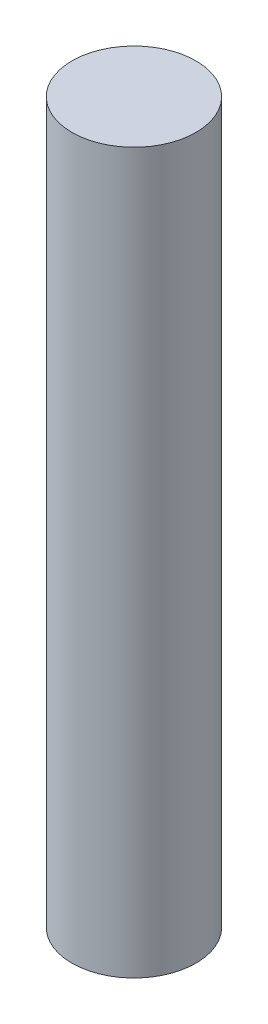
ISO-10303-21;
HEADER;
FILE_DESCRIPTION(('STEP AP214'),'2;1');
FILE_NAME('part.step','',(''),(''),'','','');
FILE_SCHEMA(('AUTOMOTIVE_DESIGN { 1 0 10303 214 1 1 1 1 }'));
ENDSEC;
DATA;
#1=APPLICATION_CONTEXT('core data for automotive mechanical design processes');
#2=APPLICATION_PROTOCOL_DEFINITION('international standard','automotive_design',2000,#1);
#3=PRODUCT_CONTEXT('',#1,'mechanical');
#4=PRODUCT('Part','Part','',(#3));
#5=PRODUCT_RELATED_PRODUCT_CATEGORY('part','',(#4));
#6=PRODUCT_DEFINITION_FORMATION('','',#4);
#7=PRODUCT_DEFINITION_CONTEXT('part definition',#1,'design');
#8=PRODUCT_DEFINITION('design','',#6,#7);
#9=PRODUCT_DEFINITION_SHAPE('','',#8);
#10=(LENGTH_UNIT() NAMED_UNIT(*) SI_UNIT(.MILLI.,.METRE.));
#11=(NAMED_UNIT(*) PLANE_ANGLE_UNIT() SI_UNIT($,.RADIAN.));
#12=(NAMED_UNIT(*) SI_UNIT($,.STERADIAN.) SOLID_ANGLE_UNIT());
#13=UNCERTAINTY_MEASURE_WITH_UNIT(LENGTH_MEASURE(1.E-05),#10,'distance_accuracy_value','');
#14=(GEOMETRIC_REPRESENTATION_CONTEXT(3) GLOBAL_UNCERTAINTY_ASSIGNED_CONTEXT((#13)) GLOBAL_UNIT_ASSIGNED_CONTEXT((#10,
#11,#12)) REPRESENTATION_CONTEXT('',''));
#15=CARTESIAN_POINT('',(0.,0.,0.));
#16=DIRECTION('',(0.,0.,1.));
#17=DIRECTION('',(1.,0.,0.));
#18=AXIS2_PLACEMENT_3D('',#15,#16,#17);
#19=CARTESIAN_POINT('',(0.,-9.525,0.));
#20=DIRECTION('',(0.,1.,0.));
#21=DIRECTION('',(0.,0.,1.));
#22=AXIS2_PLACEMENT_3D('',#19,#20,#21);
#23=CYLINDRICAL_SURFACE('',#22,4.7625);
#24=CARTESIAN_POINT('',(0.,0.,0.));
#25=DIRECTION('',(0.,1.,0.));
#26=DIRECTION('',(0.,0.,1.));
#27=AXIS2_PLACEMENT_3D('',#24,#25,#26);
#28=CIRCLE('',#27,4.7625);
#29=CARTESIAN_POINT('',(0.,0.,4.7625));
#30=VERTEX_POINT('',#29);
#31=EDGE_CURVE('E10',#30,#30,#28,.T.);
#32=CARTESIAN_POINT('',(0.,-55.245,0.));
#33=DIRECTION('',(0.,-1.,0.));
#34=DIRECTION('',(0.,0.,-1.));
#35=AXIS2_PLACEMENT_3D('',#32,#33,#34);
#36=CIRCLE('',#35,4.7625);
#37=CARTESIAN_POINT('',(0.,-55.245,4.7625));
#38=VERTEX_POINT('',#37);
#39=EDGE_CURVE('E40',#38,#38,#36,.T.);
#40=CARTESIAN_POINT('',(0.,0.,4.7625));
#41=CARTESIAN_POINT('',(0.,-0.575468749999999,4.7625));
#42=CARTESIAN_POINT('',(0.,-1.1509375,4.7625));
#43=CARTESIAN_POINT('',(0.,-2.301875,4.7625));
#44=CARTESIAN_POINT('',(0.,-2.87734375,4.7625));
#45=CARTESIAN_POINT('',(0.,-4.02828125,4.7625));
#46=CARTESIAN_POINT('',(0.,-4.60375,4.7625));
#47=CARTESIAN_POINT('',(0.,-5.7546875,4.7625));
#48=CARTESIAN_POINT('',(0.,-6.33015625,4.7625));
#49=CARTESIAN_POINT('',(0.,-7.48109375,4.7625));
#50=CARTESIAN_POINT('',(0.,-8.0565625,4.7625));
#51=CARTESIAN_POINT('',(0.,-9.2075,4.7625));
#52=CARTESIAN_POINT('',(0.,-9.78296875,4.7625));
#53=CARTESIAN_POINT('',(0.,-10.93390625,4.7625));
#54=CARTESIAN_POINT('',(0.,-11.509375,4.7625));
#55=CARTESIAN_POINT('',(0.,-12.6603125,4.7625));
#56=CARTESIAN_POINT('',(0.,-13.23578125,4.7625));
#57=CARTESIAN_POINT('',(0.,-14.38671875,4.7625));
#58=CARTESIAN_POINT('',(0.,-14.9621875,4.7625));
#59=CARTESIAN_POINT('',(0.,-16.113125,4.7625));
#60=CARTESIAN_POINT('',(0.,-16.68859375,4.7625));
#61=CARTESIAN_POINT('',(0.,-17.83953125,4.7625));
#62=CARTESIAN_POINT('',(0.,-18.415,4.7625));
#63=CARTESIAN_POINT('',(0.,-19.5659375,4.7625));
#64=CARTESIAN_POINT('',(0.,-20.14140625,4.7625));
#65=CARTESIAN_POINT('',(0.,-21.29234375,4.7625));
#66=CARTESIAN_POINT('',(0.,-21.8678125,4.7625));
#67=CARTESIAN_POINT('',(0.,-23.01875,4.7625));
#68=CARTESIAN_POINT('',(0.,-23.59421875,4.7625));
#69=CARTESIAN_POINT('',(0.,-24.74515625,4.7625));
#70=CARTESIAN_POINT('',(0.,-25.320625,4.7625));
#71=CARTESIAN_POINT('',(0.,-26.4715625,4.7625));
#72=CARTESIAN_POINT('',(0.,-27.04703125,4.7625));
#73=CARTESIAN_POINT('',(0.,-28.19796875,4.7625));
#74=CARTESIAN_POINT('',(0.,-28.7734375,4.7625));
#75=CARTESIAN_POINT('',(0.,-29.924375,4.7625));
#76=CARTESIAN_POINT('',(0.,-30.49984375,4.7625));
#77=CARTESIAN_POINT('',(0.,-31.65078125,4.7625));
#78=CARTESIAN_POINT('',(0.,-32.22625,4.7625));
#79=CARTESIAN_POINT('',(0.,-33.3771875,4.7625));
#80=CARTESIAN_POINT('',(0.,-33.95265625,4.7625));
#81=CARTESIAN_POINT('',(0.,-35.10359375,4.7625));
#82=CARTESIAN_POINT('',(0.,-35.6790625,4.7625));
#83=CARTESIAN_POINT('',(0.,-36.83,4.7625));
#84=CARTESIAN_POINT('',(0.,-37.40546875,4.7625));
#85=CARTESIAN_POINT('',(0.,-38.55640625,4.7625));
#86=CARTESIAN_POINT('',(0.,-39.131875,4.7625));
#87=CARTESIAN_POINT('',(0.,-40.2828125,4.7625));
#88=CARTESIAN_POINT('',(0.,-40.85828125,4.7625));
#89=CARTESIAN_POINT('',(0.,-42.00921875,4.7625));
#90=CARTESIAN_POINT('',(0.,-42.5846875,4.7625));
#91=CARTESIAN_POINT('',(0.,-43.735625,4.7625));
#92=CARTESIAN_POINT('',(0.,-44.31109375,4.7625));
#93=CARTESIAN_POINT('',(0.,-45.46203125,4.7625));
#94=CARTESIAN_POINT('',(0.,-46.0375,4.7625));
#95=CARTESIAN_POINT('',(0.,-47.1884375,4.7625));
#96=CARTESIAN_POINT('',(0.,-47.76390625,4.7625));
#97=CARTESIAN_POINT('',(0.,-48.91484375,4.7625));
#98=CARTESIAN_POINT('',(0.,-49.4903125,4.7625));
#99=CARTESIAN_POINT('',(0.,-50.64125,4.7625));
#100=CARTESIAN_POINT('',(0.,-51.21671875,4.7625));
#101=CARTESIAN_POINT('',(0.,-52.36765625,4.7625));
#102=CARTESIAN_POINT('',(0.,-52.943125,4.7625));
#103=CARTESIAN_POINT('',(0.,-54.0940625,4.7625));
#104=CARTESIAN_POINT('',(0.,-54.66953125,4.7625));
#105=CARTESIAN_POINT('',(0.,-55.245,4.7625));
#106=B_SPLINE_CURVE_WITH_KNOTS('',3,(#40,#41,#42,#43,#44,#45,#46,#47,#48,#49,#50,#51,#52,#53,
#54,#55,#56,#57,#58,#59,#60,#61,#62,#63,#64,#65,#66,#67,#68,#69,#70,#71,#72,#73,#74,#75,#76,#77,
#78,#79,#80,#81,#82,#83,#84,#85,#86,#87,#88,#89,#90,#91,#92,#93,#94,#95,#96,#97,#98,#99,#100,
#101,#102,#103,#104,#105),.UNSPECIFIED.,.F.,.F.,(4,2,2,2,2,2,2,2,2,2,2,2,2,2,2,2,2,2,2,2,2,2,2,
2,2,2,2,2,2,2,2,2,4),(0.,1.72640625,3.4528125,5.17921875,6.905625,8.63203125,10.3584375,
12.08484375,13.81125,15.53765625,17.2640625,18.99046875,20.716875,22.44328125,24.1696875,
25.89609375,27.6225,29.34890625,31.0753125,32.80171875,34.528125,36.25453125,37.9809375,
39.70734375,41.43375,43.16015625,44.8865625,46.61296875,48.339375,50.06578125,51.7921875,
53.51859375,55.245),.UNSPECIFIED.);
#107=EDGE_CURVE('BSEAM34',#30,#38,#106,.T.);
#108=ORIENTED_EDGE('',*,*,#31,.F.);
#109=ORIENTED_EDGE('',*,*,#39,.F.);
#110=ORIENTED_EDGE('',*,*,#107,.T.);
#111=ORIENTED_EDGE('',*,*,#107,.F.);
#112=EDGE_LOOP('',(#108,#110,#109,#111));
#113=FACE_BOUND('',#112,.T.);
#114=ADVANCED_FACE('F34',(#113),#23,.T.);
#115=CARTESIAN_POINT('',(0.,0.,0.));
#116=DIRECTION('',(0.,1.,0.));
#117=DIRECTION('',(0.,0.,1.));
#118=AXIS2_PLACEMENT_3D('',#115,#116,#117);
#119=PLANE('',#118);
#120=ORIENTED_EDGE('',*,*,#31,.T.);
#121=EDGE_LOOP('',(#120));
#122=FACE_BOUND('',#121,.T.);
#123=ADVANCED_FACE('F49',(#122),#119,.T.);
#124=CARTESIAN_POINT('',(0.,-55.245,0.));
#125=DIRECTION('',(0.,-1.,0.));
#126=DIRECTION('',(0.,0.,-1.));
#127=AXIS2_PLACEMENT_3D('',#124,#125,#126);
#128=PLANE('',#127);
#129=ORIENTED_EDGE('',*,*,#39,.T.);
#130=EDGE_LOOP('',(#129));
#131=FACE_BOUND('',#130,.T.);
#132=ADVANCED_FACE('F46',(#131),#128,.T.);
#133=CLOSED_SHELL('',(#114,#123,#132));
#134=MANIFOLD_SOLID_BREP('B2',#133);
#135=ADVANCED_BREP_SHAPE_REPRESENTATION('',(#18,#134),#14);
#136=SHAPE_DEFINITION_REPRESENTATION(#9,#135);
ENDSEC;
END-ISO-10303-21;
